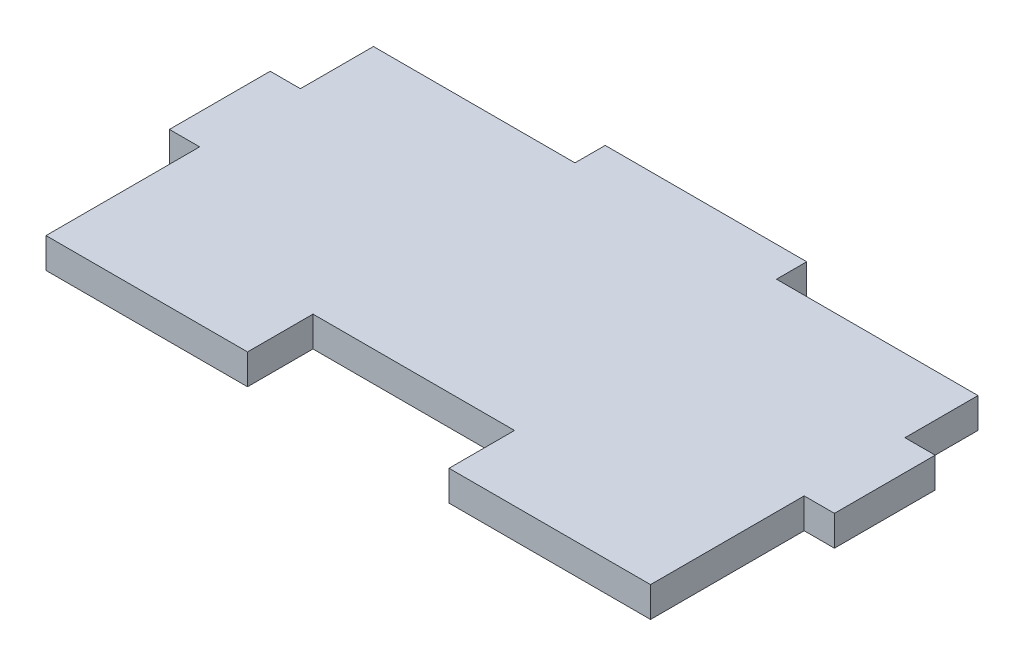
ISO-10303-21;
HEADER;
FILE_DESCRIPTION(('STEP AP214'),'2;1');
FILE_NAME('part.step','',(''),(''),'','','');
FILE_SCHEMA(('AUTOMOTIVE_DESIGN { 1 0 10303 214 1 1 1 1 }'));
ENDSEC;
DATA;
#1=APPLICATION_CONTEXT('core data for automotive mechanical design processes');
#2=APPLICATION_PROTOCOL_DEFINITION('international standard','automotive_design',2000,#1);
#3=PRODUCT_CONTEXT('',#1,'mechanical');
#4=PRODUCT('Part','Part','',(#3));
#5=PRODUCT_RELATED_PRODUCT_CATEGORY('part','',(#4));
#6=PRODUCT_DEFINITION_FORMATION('','',#4);
#7=PRODUCT_DEFINITION_CONTEXT('part definition',#1,'design');
#8=PRODUCT_DEFINITION('design','',#6,#7);
#9=PRODUCT_DEFINITION_SHAPE('','',#8);
#10=(LENGTH_UNIT() NAMED_UNIT(*) SI_UNIT(.MILLI.,.METRE.));
#11=(NAMED_UNIT(*) PLANE_ANGLE_UNIT() SI_UNIT($,.RADIAN.));
#12=(NAMED_UNIT(*) SI_UNIT($,.STERADIAN.) SOLID_ANGLE_UNIT());
#13=UNCERTAINTY_MEASURE_WITH_UNIT(LENGTH_MEASURE(1.E-05),#10,'distance_accuracy_value','');
#14=(GEOMETRIC_REPRESENTATION_CONTEXT(3) GLOBAL_UNCERTAINTY_ASSIGNED_CONTEXT((#13)) GLOBAL_UNIT_ASSIGNED_CONTEXT((#10,
#11,#12)) REPRESENTATION_CONTEXT('',''));
#15=CARTESIAN_POINT('',(0.,0.,0.));
#16=DIRECTION('',(0.,0.,1.));
#17=DIRECTION('',(1.,0.,0.));
#18=AXIS2_PLACEMENT_3D('',#15,#16,#17);
#19=CARTESIAN_POINT('',(-30.,3.,17.75));
#20=DIRECTION('',(0.,0.,-1.));
#21=DIRECTION('',(-1.,0.,0.));
#22=AXIS2_PLACEMENT_3D('',#19,#20,#21);
#23=PLANE('',#22);
#24=DIRECTION('',(1.,0.,0.));
#25=VECTOR('',#24,1.);
#26=CARTESIAN_POINT('',(-30.,0.,17.75));
#27=LINE('',#26,#25);
#28=CARTESIAN_POINT('',(-30.,0.,17.75));
#29=VERTEX_POINT('',#28);
#30=CARTESIAN_POINT('',(-10.,0.,17.75));
#31=VERTEX_POINT('',#30);
#32=EDGE_CURVE('E226',#29,#31,#27,.T.);
#33=ORIENTED_EDGE('',*,*,#32,.T.);
#34=DIRECTION('',(0.,1.,0.));
#35=VECTOR('',#34,1.);
#36=CARTESIAN_POINT('',(-10.,3.,17.75));
#37=LINE('',#36,#35);
#38=CARTESIAN_POINT('',(-10.,3.,17.75));
#39=VERTEX_POINT('',#38);
#40=EDGE_CURVE('E47',#31,#39,#37,.T.);
#41=ORIENTED_EDGE('',*,*,#40,.T.);
#42=DIRECTION('',(1.,0.,0.));
#43=VECTOR('',#42,1.);
#44=CARTESIAN_POINT('',(-30.,3.,17.75));
#45=LINE('',#44,#43);
#46=CARTESIAN_POINT('',(-30.,3.,17.75));
#47=VERTEX_POINT('',#46);
#48=EDGE_CURVE('E202',#47,#39,#45,.T.);
#49=ORIENTED_EDGE('',*,*,#48,.F.);
#50=DIRECTION('',(0.,-1.,0.));
#51=VECTOR('',#50,1.);
#52=CARTESIAN_POINT('',(-30.,3.,17.75));
#53=LINE('',#52,#51);
#54=EDGE_CURVE('E185',#47,#29,#53,.T.);
#55=ORIENTED_EDGE('',*,*,#54,.T.);
#56=EDGE_LOOP('',(#33,#41,#49,#55));
#57=FACE_BOUND('',#56,.T.);
#58=ADVANCED_FACE('F38',(#57),#23,.F.);
#59=CARTESIAN_POINT('',(-30.,3.,-17.75));
#60=DIRECTION('',(1.,0.,0.));
#61=DIRECTION('',(0.,0.,-1.));
#62=AXIS2_PLACEMENT_3D('',#59,#60,#61);
#63=PLANE('',#62);
#64=DIRECTION('',(0.,1.,0.));
#65=VECTOR('',#64,1.);
#66=CARTESIAN_POINT('',(-30.,0.,-14.75));
#67=LINE('',#66,#65);
#68=CARTESIAN_POINT('',(-30.,0.,-14.75));
#69=VERTEX_POINT('',#68);
#70=CARTESIAN_POINT('',(-30.,3.,-14.75));
#71=VERTEX_POINT('',#70);
#72=EDGE_CURVE('E287',#69,#71,#67,.T.);
#73=ORIENTED_EDGE('',*,*,#72,.F.);
#74=DIRECTION('',(0.,0.,1.));
#75=VECTOR('',#74,1.);
#76=CARTESIAN_POINT('',(-30.,0.,-17.75));
#77=LINE('',#76,#75);
#78=CARTESIAN_POINT('',(-30.,0.,-7.5));
#79=VERTEX_POINT('',#78);
#80=EDGE_CURVE('E222',#69,#79,#77,.T.);
#81=ORIENTED_EDGE('',*,*,#80,.T.);
#82=DIRECTION('',(0.,-1.,0.));
#83=VECTOR('',#82,1.);
#84=CARTESIAN_POINT('',(-30.,3.,-7.5));
#85=LINE('',#84,#83);
#86=CARTESIAN_POINT('',(-30.,3.,-7.5));
#87=VERTEX_POINT('',#86);
#88=EDGE_CURVE('E373',#87,#79,#85,.T.);
#89=ORIENTED_EDGE('',*,*,#88,.F.);
#90=DIRECTION('',(0.,0.,1.));
#91=VECTOR('',#90,1.);
#92=CARTESIAN_POINT('',(-30.,3.,-17.75));
#93=LINE('',#92,#91);
#94=EDGE_CURVE('E203',#71,#87,#93,.T.);
#95=ORIENTED_EDGE('',*,*,#94,.F.);
#96=EDGE_LOOP('',(#73,#81,#89,#95));
#97=FACE_BOUND('',#96,.T.);
#98=ADVANCED_FACE('F402',(#97),#63,.F.);
#99=CARTESIAN_POINT('',(-30.,3.,-17.75));
#100=DIRECTION('',(0.,0.,1.));
#101=DIRECTION('',(1.,0.,0.));
#102=AXIS2_PLACEMENT_3D('',#99,#100,#101);
#103=PLANE('',#102);
#104=DIRECTION('',(0.,1.,0.));
#105=VECTOR('',#104,1.);
#106=CARTESIAN_POINT('',(-10.,0.,-17.75));
#107=LINE('',#106,#105);
#108=CARTESIAN_POINT('',(-10.,0.,-17.75));
#109=VERTEX_POINT('',#108);
#110=CARTESIAN_POINT('',(-10.,3.,-17.75));
#111=VERTEX_POINT('',#110);
#112=EDGE_CURVE('E291',#109,#111,#107,.T.);
#113=ORIENTED_EDGE('',*,*,#112,.T.);
#114=DIRECTION('',(-1.,0.,0.));
#115=VECTOR('',#114,1.);
#116=CARTESIAN_POINT('',(-30.,3.,-17.75));
#117=LINE('',#116,#115);
#118=CARTESIAN_POINT('',(10.,3.,-17.75));
#119=VERTEX_POINT('',#118);
#120=EDGE_CURVE('E251',#119,#111,#117,.T.);
#121=ORIENTED_EDGE('',*,*,#120,.F.);
#122=DIRECTION('',(0.,1.,0.));
#123=VECTOR('',#122,1.);
#124=CARTESIAN_POINT('',(10.,0.,-17.75));
#125=LINE('',#124,#123);
#126=CARTESIAN_POINT('',(10.,0.,-17.75));
#127=VERTEX_POINT('',#126);
#128=EDGE_CURVE('E283',#127,#119,#125,.T.);
#129=ORIENTED_EDGE('',*,*,#128,.F.);
#130=DIRECTION('',(-1.,0.,0.));
#131=VECTOR('',#130,1.);
#132=CARTESIAN_POINT('',(-30.,0.,-17.75));
#133=LINE('',#132,#131);
#134=EDGE_CURVE('E216',#127,#109,#133,.T.);
#135=ORIENTED_EDGE('',*,*,#134,.T.);
#136=EDGE_LOOP('',(#113,#121,#129,#135));
#137=FACE_BOUND('',#136,.T.);
#138=ADVANCED_FACE('F386',(#137),#103,.F.);
#139=CARTESIAN_POINT('',(0.,3.,0.));
#140=DIRECTION('',(0.,1.,0.));
#141=DIRECTION('',(0.,0.,1.));
#142=AXIS2_PLACEMENT_3D('',#139,#140,#141);
#143=PLANE('',#142);
#144=DIRECTION('',(0.,0.,1.));
#145=VECTOR('',#144,1.);
#146=CARTESIAN_POINT('',(-10.,3.,17.75));
#147=LINE('',#146,#145);
#148=CARTESIAN_POINT('',(-10.,3.,11.25));
#149=VERTEX_POINT('',#148);
#150=EDGE_CURVE('E242',#149,#39,#147,.T.);
#151=ORIENTED_EDGE('',*,*,#150,.F.);
#152=DIRECTION('',(-1.,0.,0.));
#153=VECTOR('',#152,1.);
#154=CARTESIAN_POINT('',(-10.,3.,11.25));
#155=LINE('',#154,#153);
#156=CARTESIAN_POINT('',(10.,3.,11.25));
#157=VERTEX_POINT('',#156);
#158=EDGE_CURVE('E194',#157,#149,#155,.T.);
#159=ORIENTED_EDGE('',*,*,#158,.F.);
#160=DIRECTION('',(0.,0.,-1.));
#161=VECTOR('',#160,1.);
#162=CARTESIAN_POINT('',(10.,3.,11.25));
#163=LINE('',#162,#161);
#164=CARTESIAN_POINT('',(10.,3.,17.75));
#165=VERTEX_POINT('',#164);
#166=EDGE_CURVE('E179',#165,#157,#163,.T.);
#167=ORIENTED_EDGE('',*,*,#166,.F.);
#168=CARTESIAN_POINT('',(30.,3.,17.75));
#169=VERTEX_POINT('',#168);
#170=EDGE_CURVE('E191',#165,#169,#45,.T.);
#171=ORIENTED_EDGE('',*,*,#170,.T.);
#172=DIRECTION('',(0.,0.,-1.));
#173=VECTOR('',#172,1.);
#174=CARTESIAN_POINT('',(30.,3.,-17.75));
#175=LINE('',#174,#173);
#176=CARTESIAN_POINT('',(30.,3.,2.5));
#177=VERTEX_POINT('',#176);
#178=EDGE_CURVE('E377',#169,#177,#175,.T.);
#179=ORIENTED_EDGE('',*,*,#178,.T.);
#180=DIRECTION('',(1.,0.,0.));
#181=VECTOR('',#180,1.);
#182=CARTESIAN_POINT('',(33.,3.,2.5));
#183=LINE('',#182,#181);
#184=CARTESIAN_POINT('',(33.,3.,2.5));
#185=VERTEX_POINT('',#184);
#186=EDGE_CURVE('E312',#177,#185,#183,.T.);
#187=ORIENTED_EDGE('',*,*,#186,.T.);
#188=DIRECTION('',(0.,0.,-1.));
#189=VECTOR('',#188,1.);
#190=CARTESIAN_POINT('',(33.,3.,-7.5));
#191=LINE('',#190,#189);
#192=CARTESIAN_POINT('',(33.,3.,-7.5));
#193=VERTEX_POINT('',#192);
#194=EDGE_CURVE('E315',#185,#193,#191,.T.);
#195=ORIENTED_EDGE('',*,*,#194,.T.);
#196=DIRECTION('',(-1.,0.,0.));
#197=VECTOR('',#196,1.);
#198=CARTESIAN_POINT('',(30.,3.,-7.5));
#199=LINE('',#198,#197);
#200=CARTESIAN_POINT('',(30.,3.,-7.5));
#201=VERTEX_POINT('',#200);
#202=EDGE_CURVE('E319',#193,#201,#199,.T.);
#203=ORIENTED_EDGE('',*,*,#202,.T.);
#204=CARTESIAN_POINT('',(30.,3.,-14.75));
#205=VERTEX_POINT('',#204);
#206=EDGE_CURVE('E230',#201,#205,#175,.T.);
#207=ORIENTED_EDGE('',*,*,#206,.T.);
#208=DIRECTION('',(1.,0.,0.));
#209=VECTOR('',#208,1.);
#210=CARTESIAN_POINT('',(0.,3.,-14.75));
#211=LINE('',#210,#209);
#212=CARTESIAN_POINT('',(10.,3.,-14.75));
#213=VERTEX_POINT('',#212);
#214=EDGE_CURVE('E265',#213,#205,#211,.T.);
#215=ORIENTED_EDGE('',*,*,#214,.F.);
#216=DIRECTION('',(0.,0.,-1.));
#217=VECTOR('',#216,1.);
#218=CARTESIAN_POINT('',(10.,3.,0.));
#219=LINE('',#218,#217);
#220=EDGE_CURVE('E260',#213,#119,#219,.T.);
#221=ORIENTED_EDGE('',*,*,#220,.T.);
#222=ORIENTED_EDGE('',*,*,#120,.T.);
#223=DIRECTION('',(0.,0.,1.));
#224=VECTOR('',#223,1.);
#225=CARTESIAN_POINT('',(-10.,3.,0.));
#226=LINE('',#225,#224);
#227=CARTESIAN_POINT('',(-10.,3.,-14.75));
#228=VERTEX_POINT('',#227);
#229=EDGE_CURVE('E275',#111,#228,#226,.T.);
#230=ORIENTED_EDGE('',*,*,#229,.T.);
#231=DIRECTION('',(-1.,0.,0.));
#232=VECTOR('',#231,1.);
#233=CARTESIAN_POINT('',(0.,3.,-14.75));
#234=LINE('',#233,#232);
#235=EDGE_CURVE('E279',#228,#71,#234,.T.);
#236=ORIENTED_EDGE('',*,*,#235,.T.);
#237=ORIENTED_EDGE('',*,*,#94,.T.);
#238=DIRECTION('',(-1.,0.,0.));
#239=VECTOR('',#238,1.);
#240=CARTESIAN_POINT('',(-30.,3.,-7.5));
#241=LINE('',#240,#239);
#242=CARTESIAN_POINT('',(-33.,3.,-7.5));
#243=VERTEX_POINT('',#242);
#244=EDGE_CURVE('E346',#87,#243,#241,.T.);
#245=ORIENTED_EDGE('',*,*,#244,.T.);
#246=DIRECTION('',(0.,0.,1.));
#247=VECTOR('',#246,1.);
#248=CARTESIAN_POINT('',(-33.,3.,-7.5));
#249=LINE('',#248,#247);
#250=CARTESIAN_POINT('',(-33.,3.,2.5));
#251=VERTEX_POINT('',#250);
#252=EDGE_CURVE('E349',#243,#251,#249,.T.);
#253=ORIENTED_EDGE('',*,*,#252,.T.);
#254=DIRECTION('',(1.,0.,0.));
#255=VECTOR('',#254,1.);
#256=CARTESIAN_POINT('',(-33.,3.,2.5));
#257=LINE('',#256,#255);
#258=CARTESIAN_POINT('',(-30.,3.,2.5));
#259=VERTEX_POINT('',#258);
#260=EDGE_CURVE('E246',#251,#259,#257,.T.);
#261=ORIENTED_EDGE('',*,*,#260,.T.);
#262=EDGE_CURVE('E208',#259,#47,#93,.T.);
#263=ORIENTED_EDGE('',*,*,#262,.T.);
#264=ORIENTED_EDGE('',*,*,#48,.T.);
#265=EDGE_LOOP('',(#151,#159,#167,#171,#179,#187,#195,#203,#207,#215,#221,#222,#230,#236,#237,
#245,#253,#261,#263,#264));
#266=FACE_BOUND('',#265,.T.);
#267=ADVANCED_FACE('F189',(#266),#143,.T.);
#268=CARTESIAN_POINT('',(0.,0.,0.));
#269=DIRECTION('',(0.,1.,0.));
#270=DIRECTION('',(0.,0.,1.));
#271=AXIS2_PLACEMENT_3D('',#268,#269,#270);
#272=PLANE('',#271);
#273=DIRECTION('',(-1.,0.,0.));
#274=VECTOR('',#273,1.);
#275=CARTESIAN_POINT('',(0.,0.,11.25));
#276=LINE('',#275,#274);
#277=CARTESIAN_POINT('',(10.,0.,11.25));
#278=VERTEX_POINT('',#277);
#279=CARTESIAN_POINT('',(-10.,0.,11.25));
#280=VERTEX_POINT('',#279);
#281=EDGE_CURVE('E11',#278,#280,#276,.T.);
#282=ORIENTED_EDGE('',*,*,#281,.T.);
#283=DIRECTION('',(0.,0.,1.));
#284=VECTOR('',#283,1.);
#285=CARTESIAN_POINT('',(-10.,0.,0.));
#286=LINE('',#285,#284);
#287=EDGE_CURVE('E257',#280,#31,#286,.T.);
#288=ORIENTED_EDGE('',*,*,#287,.T.);
#289=ORIENTED_EDGE('',*,*,#32,.F.);
#290=CARTESIAN_POINT('',(-30.,0.,2.5));
#291=VERTEX_POINT('',#290);
#292=EDGE_CURVE('E221',#291,#29,#77,.T.);
#293=ORIENTED_EDGE('',*,*,#292,.F.);
#294=DIRECTION('',(1.,0.,0.));
#295=VECTOR('',#294,1.);
#296=CARTESIAN_POINT('',(-33.,0.,2.5));
#297=LINE('',#296,#295);
#298=CARTESIAN_POINT('',(-33.,0.,2.5));
#299=VERTEX_POINT('',#298);
#300=EDGE_CURVE('E350',#299,#291,#297,.T.);
#301=ORIENTED_EDGE('',*,*,#300,.F.);
#302=DIRECTION('',(0.,0.,1.));
#303=VECTOR('',#302,1.);
#304=CARTESIAN_POINT('',(-33.,0.,-7.5));
#305=LINE('',#304,#303);
#306=CARTESIAN_POINT('',(-33.,0.,-7.5));
#307=VERTEX_POINT('',#306);
#308=EDGE_CURVE('E358',#307,#299,#305,.T.);
#309=ORIENTED_EDGE('',*,*,#308,.F.);
#310=DIRECTION('',(-1.,0.,0.));
#311=VECTOR('',#310,1.);
#312=CARTESIAN_POINT('',(-30.,0.,-7.5));
#313=LINE('',#312,#311);
#314=EDGE_CURVE('E345',#79,#307,#313,.T.);
#315=ORIENTED_EDGE('',*,*,#314,.F.);
#316=ORIENTED_EDGE('',*,*,#80,.F.);
#317=DIRECTION('',(-1.,0.,0.));
#318=VECTOR('',#317,1.);
#319=CARTESIAN_POINT('',(0.,0.,-14.75));
#320=LINE('',#319,#318);
#321=CARTESIAN_POINT('',(-10.,0.,-14.75));
#322=VERTEX_POINT('',#321);
#323=EDGE_CURVE('E271',#322,#69,#320,.T.);
#324=ORIENTED_EDGE('',*,*,#323,.F.);
#325=DIRECTION('',(0.,0.,1.));
#326=VECTOR('',#325,1.);
#327=CARTESIAN_POINT('',(-10.,0.,0.));
#328=LINE('',#327,#326);
#329=EDGE_CURVE('E274',#109,#322,#328,.T.);
#330=ORIENTED_EDGE('',*,*,#329,.F.);
#331=ORIENTED_EDGE('',*,*,#134,.F.);
#332=DIRECTION('',(0.,0.,-1.));
#333=VECTOR('',#332,1.);
#334=CARTESIAN_POINT('',(10.,0.,0.));
#335=LINE('',#334,#333);
#336=CARTESIAN_POINT('',(10.,0.,-14.75));
#337=VERTEX_POINT('',#336);
#338=EDGE_CURVE('E297',#337,#127,#335,.T.);
#339=ORIENTED_EDGE('',*,*,#338,.F.);
#340=DIRECTION('',(1.,0.,0.));
#341=VECTOR('',#340,1.);
#342=CARTESIAN_POINT('',(0.,0.,-14.75));
#343=LINE('',#342,#341);
#344=CARTESIAN_POINT('',(30.,0.,-14.75));
#345=VERTEX_POINT('',#344);
#346=EDGE_CURVE('E300',#337,#345,#343,.T.);
#347=ORIENTED_EDGE('',*,*,#346,.T.);
#348=DIRECTION('',(0.,0.,-1.));
#349=VECTOR('',#348,1.);
#350=CARTESIAN_POINT('',(30.,0.,-17.75));
#351=LINE('',#350,#349);
#352=CARTESIAN_POINT('',(30.,0.,-7.5));
#353=VERTEX_POINT('',#352);
#354=EDGE_CURVE('E217',#353,#345,#351,.T.);
#355=ORIENTED_EDGE('',*,*,#354,.F.);
#356=DIRECTION('',(-1.,0.,0.));
#357=VECTOR('',#356,1.);
#358=CARTESIAN_POINT('',(30.,0.,-7.5));
#359=LINE('',#358,#357);
#360=CARTESIAN_POINT('',(33.,0.,-7.5));
#361=VERTEX_POINT('',#360);
#362=EDGE_CURVE('E316',#361,#353,#359,.T.);
#363=ORIENTED_EDGE('',*,*,#362,.F.);
#364=DIRECTION('',(0.,0.,-1.));
#365=VECTOR('',#364,1.);
#366=CARTESIAN_POINT('',(33.,0.,-7.5));
#367=LINE('',#366,#365);
#368=CARTESIAN_POINT('',(33.,0.,2.5));
#369=VERTEX_POINT('',#368);
#370=EDGE_CURVE('E325',#369,#361,#367,.T.);
#371=ORIENTED_EDGE('',*,*,#370,.F.);
#372=DIRECTION('',(1.,0.,0.));
#373=VECTOR('',#372,1.);
#374=CARTESIAN_POINT('',(33.,0.,2.5));
#375=LINE('',#374,#373);
#376=CARTESIAN_POINT('',(30.,0.,2.5));
#377=VERTEX_POINT('',#376);
#378=EDGE_CURVE('E290',#377,#369,#375,.T.);
#379=ORIENTED_EDGE('',*,*,#378,.F.);
#380=CARTESIAN_POINT('',(30.,0.,17.75));
#381=VERTEX_POINT('',#380);
#382=EDGE_CURVE('E212',#381,#377,#351,.T.);
#383=ORIENTED_EDGE('',*,*,#382,.F.);
#384=CARTESIAN_POINT('',(10.,0.,17.75));
#385=VERTEX_POINT('',#384);
#386=EDGE_CURVE('E225',#385,#381,#27,.T.);
#387=ORIENTED_EDGE('',*,*,#386,.F.);
#388=DIRECTION('',(0.,0.,-1.));
#389=VECTOR('',#388,1.);
#390=CARTESIAN_POINT('',(10.,0.,0.));
#391=LINE('',#390,#389);
#392=EDGE_CURVE('E54',#385,#278,#391,.T.);
#393=ORIENTED_EDGE('',*,*,#392,.T.);
#394=EDGE_LOOP('',(#282,#288,#289,#293,#301,#309,#315,#316,#324,#330,#331,#339,#347,#355,#363,
#371,#379,#383,#387,#393));
#395=FACE_BOUND('',#394,.T.);
#396=ADVANCED_FACE('F255',(#395),#272,.F.);
#397=CARTESIAN_POINT('',(30.,3.,-17.75));
#398=DIRECTION('',(-1.,0.,0.));
#399=DIRECTION('',(0.,0.,1.));
#400=AXIS2_PLACEMENT_3D('',#397,#398,#399);
#401=PLANE('',#400);
#402=DIRECTION('',(0.,-1.,0.));
#403=VECTOR('',#402,1.);
#404=CARTESIAN_POINT('',(30.,3.,2.5));
#405=LINE('',#404,#403);
#406=EDGE_CURVE('E341',#177,#377,#405,.T.);
#407=ORIENTED_EDGE('',*,*,#406,.F.);
#408=ORIENTED_EDGE('',*,*,#178,.F.);
#409=DIRECTION('',(0.,-1.,0.));
#410=VECTOR('',#409,1.);
#411=CARTESIAN_POINT('',(30.,3.,17.75));
#412=LINE('',#411,#410);
#413=EDGE_CURVE('E199',#169,#381,#412,.T.);
#414=ORIENTED_EDGE('',*,*,#413,.T.);
#415=ORIENTED_EDGE('',*,*,#382,.T.);
#416=EDGE_LOOP('',(#407,#408,#414,#415));
#417=FACE_BOUND('',#416,.T.);
#418=ADVANCED_FACE('F446',(#417),#401,.F.);
#419=ORIENTED_EDGE('',*,*,#354,.T.);
#420=DIRECTION('',(0.,1.,0.));
#421=VECTOR('',#420,1.);
#422=CARTESIAN_POINT('',(30.,0.,-14.75));
#423=LINE('',#422,#421);
#424=EDGE_CURVE('E62',#345,#205,#423,.T.);
#425=ORIENTED_EDGE('',*,*,#424,.T.);
#426=ORIENTED_EDGE('',*,*,#206,.F.);
#427=DIRECTION('',(0.,-1.,0.));
#428=VECTOR('',#427,1.);
#429=CARTESIAN_POINT('',(30.,3.,-7.5));
#430=LINE('',#429,#428);
#431=EDGE_CURVE('E322',#201,#353,#430,.T.);
#432=ORIENTED_EDGE('',*,*,#431,.T.);
#433=EDGE_LOOP('',(#419,#425,#426,#432));
#434=FACE_BOUND('',#433,.T.);
#435=ADVANCED_FACE('F40',(#434),#401,.F.);
#436=ORIENTED_EDGE('',*,*,#262,.F.);
#437=DIRECTION('',(0.,-1.,0.));
#438=VECTOR('',#437,1.);
#439=CARTESIAN_POINT('',(-30.,3.,2.5));
#440=LINE('',#439,#438);
#441=EDGE_CURVE('E355',#259,#291,#440,.T.);
#442=ORIENTED_EDGE('',*,*,#441,.T.);
#443=ORIENTED_EDGE('',*,*,#292,.T.);
#444=ORIENTED_EDGE('',*,*,#54,.F.);
#445=EDGE_LOOP('',(#436,#442,#443,#444));
#446=FACE_BOUND('',#445,.T.);
#447=ADVANCED_FACE('F252',(#446),#63,.F.);
#448=ORIENTED_EDGE('',*,*,#170,.F.);
#449=DIRECTION('',(0.,-1.,0.));
#450=VECTOR('',#449,1.);
#451=CARTESIAN_POINT('',(10.,3.,17.75));
#452=LINE('',#451,#450);
#453=EDGE_CURVE('E176',#165,#385,#452,.T.);
#454=ORIENTED_EDGE('',*,*,#453,.T.);
#455=ORIENTED_EDGE('',*,*,#386,.T.);
#456=ORIENTED_EDGE('',*,*,#413,.F.);
#457=EDGE_LOOP('',(#448,#454,#455,#456));
#458=FACE_BOUND('',#457,.T.);
#459=ADVANCED_FACE('F197',(#458),#23,.F.);
#460=CARTESIAN_POINT('',(-30.,3.,-7.5));
#461=DIRECTION('',(0.,0.,1.));
#462=DIRECTION('',(1.,0.,0.));
#463=AXIS2_PLACEMENT_3D('',#460,#461,#462);
#464=PLANE('',#463);
#465=ORIENTED_EDGE('',*,*,#314,.T.);
#466=DIRECTION('',(0.,-1.,0.));
#467=VECTOR('',#466,1.);
#468=CARTESIAN_POINT('',(-33.,3.,-7.5));
#469=LINE('',#468,#467);
#470=EDGE_CURVE('E369',#243,#307,#469,.T.);
#471=ORIENTED_EDGE('',*,*,#470,.F.);
#472=ORIENTED_EDGE('',*,*,#244,.F.);
#473=ORIENTED_EDGE('',*,*,#88,.T.);
#474=EDGE_LOOP('',(#465,#471,#472,#473));
#475=FACE_BOUND('',#474,.T.);
#476=ADVANCED_FACE('F407',(#475),#464,.F.);
#477=CARTESIAN_POINT('',(-33.,3.,-7.5));
#478=DIRECTION('',(1.,0.,0.));
#479=DIRECTION('',(0.,0.,-1.));
#480=AXIS2_PLACEMENT_3D('',#477,#478,#479);
#481=PLANE('',#480);
#482=ORIENTED_EDGE('',*,*,#308,.T.);
#483=DIRECTION('',(0.,-1.,0.));
#484=VECTOR('',#483,1.);
#485=CARTESIAN_POINT('',(-33.,3.,2.5));
#486=LINE('',#485,#484);
#487=EDGE_CURVE('E365',#251,#299,#486,.T.);
#488=ORIENTED_EDGE('',*,*,#487,.F.);
#489=ORIENTED_EDGE('',*,*,#252,.F.);
#490=ORIENTED_EDGE('',*,*,#470,.T.);
#491=EDGE_LOOP('',(#482,#488,#489,#490));
#492=FACE_BOUND('',#491,.T.);
#493=ADVANCED_FACE('F412',(#492),#481,.F.);
#494=CARTESIAN_POINT('',(-33.,3.,2.5));
#495=DIRECTION('',(0.,0.,-1.));
#496=DIRECTION('',(-1.,0.,0.));
#497=AXIS2_PLACEMENT_3D('',#494,#495,#496);
#498=PLANE('',#497);
#499=ORIENTED_EDGE('',*,*,#300,.T.);
#500=ORIENTED_EDGE('',*,*,#441,.F.);
#501=ORIENTED_EDGE('',*,*,#260,.F.);
#502=ORIENTED_EDGE('',*,*,#487,.T.);
#503=EDGE_LOOP('',(#499,#500,#501,#502));
#504=FACE_BOUND('',#503,.T.);
#505=ADVANCED_FACE('F414',(#504),#498,.F.);
#506=CARTESIAN_POINT('',(33.,3.,2.5));
#507=DIRECTION('',(0.,0.,-1.));
#508=DIRECTION('',(-1.,0.,0.));
#509=AXIS2_PLACEMENT_3D('',#506,#507,#508);
#510=PLANE('',#509);
#511=ORIENTED_EDGE('',*,*,#378,.T.);
#512=DIRECTION('',(0.,-1.,0.));
#513=VECTOR('',#512,1.);
#514=CARTESIAN_POINT('',(33.,3.,2.5));
#515=LINE('',#514,#513);
#516=EDGE_CURVE('E337',#185,#369,#515,.T.);
#517=ORIENTED_EDGE('',*,*,#516,.F.);
#518=ORIENTED_EDGE('',*,*,#186,.F.);
#519=ORIENTED_EDGE('',*,*,#406,.T.);
#520=EDGE_LOOP('',(#511,#517,#518,#519));
#521=FACE_BOUND('',#520,.T.);
#522=ADVANCED_FACE('F416',(#521),#510,.F.);
#523=CARTESIAN_POINT('',(33.,3.,-7.5));
#524=DIRECTION('',(-1.,0.,0.));
#525=DIRECTION('',(0.,0.,1.));
#526=AXIS2_PLACEMENT_3D('',#523,#524,#525);
#527=PLANE('',#526);
#528=ORIENTED_EDGE('',*,*,#370,.T.);
#529=DIRECTION('',(0.,-1.,0.));
#530=VECTOR('',#529,1.);
#531=CARTESIAN_POINT('',(33.,3.,-7.5));
#532=LINE('',#531,#530);
#533=EDGE_CURVE('E333',#193,#361,#532,.T.);
#534=ORIENTED_EDGE('',*,*,#533,.F.);
#535=ORIENTED_EDGE('',*,*,#194,.F.);
#536=ORIENTED_EDGE('',*,*,#516,.T.);
#537=EDGE_LOOP('',(#528,#534,#535,#536));
#538=FACE_BOUND('',#537,.T.);
#539=ADVANCED_FACE('F422',(#538),#527,.F.);
#540=CARTESIAN_POINT('',(30.,3.,-7.5));
#541=DIRECTION('',(0.,0.,1.));
#542=DIRECTION('',(1.,0.,0.));
#543=AXIS2_PLACEMENT_3D('',#540,#541,#542);
#544=PLANE('',#543);
#545=ORIENTED_EDGE('',*,*,#362,.T.);
#546=ORIENTED_EDGE('',*,*,#431,.F.);
#547=ORIENTED_EDGE('',*,*,#202,.F.);
#548=ORIENTED_EDGE('',*,*,#533,.T.);
#549=EDGE_LOOP('',(#545,#546,#547,#548));
#550=FACE_BOUND('',#549,.T.);
#551=ADVANCED_FACE('F471',(#550),#544,.F.);
#552=CARTESIAN_POINT('',(10.,0.,0.));
#553=DIRECTION('',(1.,0.,0.));
#554=DIRECTION('',(0.,0.,-1.));
#555=AXIS2_PLACEMENT_3D('',#552,#553,#554);
#556=PLANE('',#555);
#557=ORIENTED_EDGE('',*,*,#220,.F.);
#558=DIRECTION('',(0.,1.,0.));
#559=VECTOR('',#558,1.);
#560=CARTESIAN_POINT('',(10.,0.,-14.75));
#561=LINE('',#560,#559);
#562=EDGE_CURVE('E302',#337,#213,#561,.T.);
#563=ORIENTED_EDGE('',*,*,#562,.F.);
#564=ORIENTED_EDGE('',*,*,#338,.T.);
#565=ORIENTED_EDGE('',*,*,#128,.T.);
#566=EDGE_LOOP('',(#557,#563,#564,#565));
#567=FACE_BOUND('',#566,.T.);
#568=ADVANCED_FACE('F482',(#567),#556,.T.);
#569=CARTESIAN_POINT('',(0.,0.,-14.75));
#570=DIRECTION('',(0.,0.,1.));
#571=DIRECTION('',(1.,0.,0.));
#572=AXIS2_PLACEMENT_3D('',#569,#570,#571);
#573=PLANE('',#572);
#574=ORIENTED_EDGE('',*,*,#214,.T.);
#575=ORIENTED_EDGE('',*,*,#424,.F.);
#576=ORIENTED_EDGE('',*,*,#346,.F.);
#577=ORIENTED_EDGE('',*,*,#562,.T.);
#578=EDGE_LOOP('',(#574,#575,#576,#577));
#579=FACE_BOUND('',#578,.T.);
#580=ADVANCED_FACE('F480',(#579),#573,.F.);
#581=CARTESIAN_POINT('',(0.,0.,-14.75));
#582=DIRECTION('',(0.,0.,-1.));
#583=DIRECTION('',(-1.,0.,0.));
#584=AXIS2_PLACEMENT_3D('',#581,#582,#583);
#585=PLANE('',#584);
#586=ORIENTED_EDGE('',*,*,#235,.F.);
#587=DIRECTION('',(0.,1.,0.));
#588=VECTOR('',#587,1.);
#589=CARTESIAN_POINT('',(-10.,0.,-14.75));
#590=LINE('',#589,#588);
#591=EDGE_CURVE('E278',#322,#228,#590,.T.);
#592=ORIENTED_EDGE('',*,*,#591,.F.);
#593=ORIENTED_EDGE('',*,*,#323,.T.);
#594=ORIENTED_EDGE('',*,*,#72,.T.);
#595=EDGE_LOOP('',(#586,#592,#593,#594));
#596=FACE_BOUND('',#595,.T.);
#597=ADVANCED_FACE('F399',(#596),#585,.T.);
#598=CARTESIAN_POINT('',(-10.,0.,0.));
#599=DIRECTION('',(-1.,0.,0.));
#600=DIRECTION('',(0.,0.,1.));
#601=AXIS2_PLACEMENT_3D('',#598,#599,#600);
#602=PLANE('',#601);
#603=ORIENTED_EDGE('',*,*,#229,.F.);
#604=ORIENTED_EDGE('',*,*,#112,.F.);
#605=ORIENTED_EDGE('',*,*,#329,.T.);
#606=ORIENTED_EDGE('',*,*,#591,.T.);
#607=EDGE_LOOP('',(#603,#604,#605,#606));
#608=FACE_BOUND('',#607,.T.);
#609=ADVANCED_FACE('F390',(#608),#602,.T.);
#610=CARTESIAN_POINT('',(-10.,-7.,11.25));
#611=DIRECTION('',(0.,0.,-1.));
#612=DIRECTION('',(-1.,0.,0.));
#613=AXIS2_PLACEMENT_3D('',#610,#611,#612);
#614=PLANE('',#613);
#615=DIRECTION('',(0.,1.,0.));
#616=VECTOR('',#615,1.);
#617=CARTESIAN_POINT('',(10.,-7.,11.25));
#618=LINE('',#617,#616);
#619=EDGE_CURVE('E580',#278,#157,#618,.T.);
#620=ORIENTED_EDGE('',*,*,#619,.T.);
#621=ORIENTED_EDGE('',*,*,#158,.T.);
#622=DIRECTION('',(0.,1.,0.));
#623=VECTOR('',#622,1.);
#624=CARTESIAN_POINT('',(-10.,-7.,11.25));
#625=LINE('',#624,#623);
#626=EDGE_CURVE('E267',#280,#149,#625,.T.);
#627=ORIENTED_EDGE('',*,*,#626,.F.);
#628=ORIENTED_EDGE('',*,*,#281,.F.);
#629=EDGE_LOOP('',(#620,#621,#627,#628));
#630=FACE_BOUND('',#629,.T.);
#631=ADVANCED_FACE('F545',(#630),#614,.F.);
#632=CARTESIAN_POINT('',(-10.,-7.,17.75));
#633=DIRECTION('',(-1.,0.,0.));
#634=DIRECTION('',(0.,0.,1.));
#635=AXIS2_PLACEMENT_3D('',#632,#633,#634);
#636=PLANE('',#635);
#637=ORIENTED_EDGE('',*,*,#626,.T.);
#638=ORIENTED_EDGE('',*,*,#150,.T.);
#639=ORIENTED_EDGE('',*,*,#40,.F.);
#640=ORIENTED_EDGE('',*,*,#287,.F.);
#641=EDGE_LOOP('',(#637,#638,#639,#640));
#642=FACE_BOUND('',#641,.T.);
#643=ADVANCED_FACE('F558',(#642),#636,.F.);
#644=CARTESIAN_POINT('',(10.,-7.,11.25));
#645=DIRECTION('',(1.,0.,0.));
#646=DIRECTION('',(0.,0.,-1.));
#647=AXIS2_PLACEMENT_3D('',#644,#645,#646);
#648=PLANE('',#647);
#649=ORIENTED_EDGE('',*,*,#453,.F.);
#650=ORIENTED_EDGE('',*,*,#166,.T.);
#651=ORIENTED_EDGE('',*,*,#619,.F.);
#652=ORIENTED_EDGE('',*,*,#392,.F.);
#653=EDGE_LOOP('',(#649,#650,#651,#652));
#654=FACE_BOUND('',#653,.T.);
#655=ADVANCED_FACE('F178',(#654),#648,.F.);
#656=CLOSED_SHELL('',(#58,#98,#138,#267,#396,#418,#435,#447,#459,#476,#493,#505,#522,#539,#551,
#568,#580,#597,#609,#631,#643,#655));
#657=MANIFOLD_SOLID_BREP('B2',#656);
#658=ADVANCED_BREP_SHAPE_REPRESENTATION('',(#18,#657),#14);
#659=SHAPE_DEFINITION_REPRESENTATION(#9,#658);
ENDSEC;
END-ISO-10303-21;
